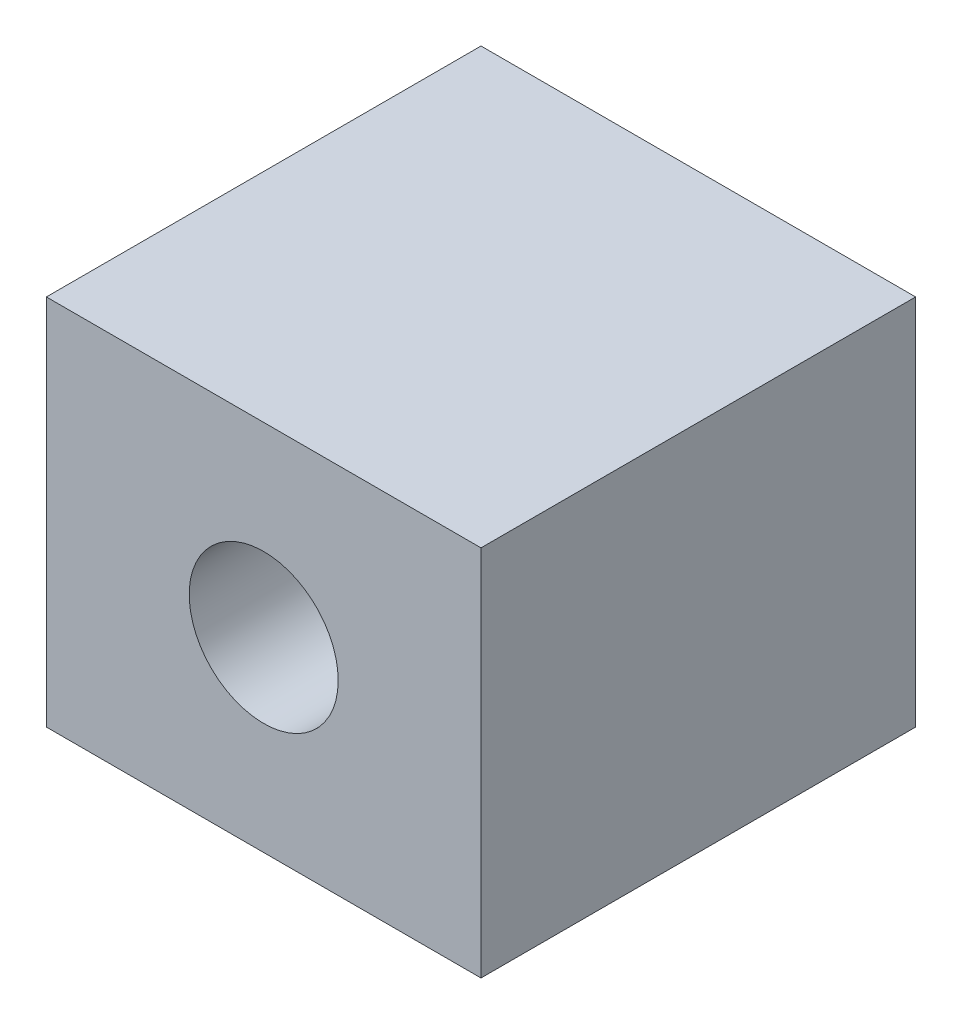
ISO-10303-21;
HEADER;
FILE_DESCRIPTION(('STEP AP214'),'2;1');
FILE_NAME('part.step','',(''),(''),'','','');
FILE_SCHEMA(('AUTOMOTIVE_DESIGN { 1 0 10303 214 1 1 1 1 }'));
ENDSEC;
DATA;
#1=APPLICATION_CONTEXT('core data for automotive mechanical design processes');
#2=APPLICATION_PROTOCOL_DEFINITION('international standard','automotive_design',2000,#1);
#3=PRODUCT_CONTEXT('',#1,'mechanical');
#4=PRODUCT('Part','Part','',(#3));
#5=PRODUCT_RELATED_PRODUCT_CATEGORY('part','',(#4));
#6=PRODUCT_DEFINITION_FORMATION('','',#4);
#7=PRODUCT_DEFINITION_CONTEXT('part definition',#1,'design');
#8=PRODUCT_DEFINITION('design','',#6,#7);
#9=PRODUCT_DEFINITION_SHAPE('','',#8);
#10=(LENGTH_UNIT() NAMED_UNIT(*) SI_UNIT(.MILLI.,.METRE.));
#11=(NAMED_UNIT(*) PLANE_ANGLE_UNIT() SI_UNIT($,.RADIAN.));
#12=(NAMED_UNIT(*) SI_UNIT($,.STERADIAN.) SOLID_ANGLE_UNIT());
#13=UNCERTAINTY_MEASURE_WITH_UNIT(LENGTH_MEASURE(1.E-05),#10,'distance_accuracy_value','');
#14=(GEOMETRIC_REPRESENTATION_CONTEXT(3) GLOBAL_UNCERTAINTY_ASSIGNED_CONTEXT((#13)) GLOBAL_UNIT_ASSIGNED_CONTEXT((#10,
#11,#12)) REPRESENTATION_CONTEXT('',''));
#15=CARTESIAN_POINT('',(0.,0.,0.));
#16=DIRECTION('',(0.,0.,1.));
#17=DIRECTION('',(1.,0.,0.));
#18=AXIS2_PLACEMENT_3D('',#15,#16,#17);
#19=CARTESIAN_POINT('',(0.,0.,35.));
#20=DIRECTION('',(0.,0.,-1.));
#21=DIRECTION('',(-1.,0.,0.));
#22=AXIS2_PLACEMENT_3D('',#19,#20,#21);
#23=PLANE('',#22);
#24=DIRECTION('',(0.,1.,0.));
#25=VECTOR('',#24,1.);
#26=CARTESIAN_POINT('',(17.5,-15.,35.));
#27=LINE('',#26,#25);
#28=CARTESIAN_POINT('',(17.5,-15.,35.));
#29=VERTEX_POINT('',#28);
#30=CARTESIAN_POINT('',(17.5,15.,35.));
#31=VERTEX_POINT('',#30);
#32=EDGE_CURVE('E89',#29,#31,#27,.T.);
#33=ORIENTED_EDGE('',*,*,#32,.T.);
#34=DIRECTION('',(-1.,0.,0.));
#35=VECTOR('',#34,1.);
#36=CARTESIAN_POINT('',(-17.5,15.,35.));
#37=LINE('',#36,#35);
#38=CARTESIAN_POINT('',(-17.5,15.,35.));
#39=VERTEX_POINT('',#38);
#40=EDGE_CURVE('E84',#31,#39,#37,.T.);
#41=ORIENTED_EDGE('',*,*,#40,.T.);
#42=DIRECTION('',(0.,-1.,0.));
#43=VECTOR('',#42,1.);
#44=CARTESIAN_POINT('',(-17.5,-15.,35.));
#45=LINE('',#44,#43);
#46=CARTESIAN_POINT('',(-17.5,-15.,35.));
#47=VERTEX_POINT('',#46);
#48=EDGE_CURVE('E87',#39,#47,#45,.T.);
#49=ORIENTED_EDGE('',*,*,#48,.T.);
#50=DIRECTION('',(1.,0.,0.));
#51=VECTOR('',#50,1.);
#52=CARTESIAN_POINT('',(-17.5,-15.,35.));
#53=LINE('',#52,#51);
#54=EDGE_CURVE('E54',#47,#29,#53,.T.);
#55=ORIENTED_EDGE('',*,*,#54,.T.);
#56=EDGE_LOOP('',(#33,#41,#49,#55));
#57=FACE_BOUND('',#56,.T.);
#58=CARTESIAN_POINT('',(0.,0.,35.));
#59=DIRECTION('',(0.,0.,1.));
#60=DIRECTION('',(1.,0.,0.));
#61=AXIS2_PLACEMENT_3D('',#58,#59,#60);
#62=CIRCLE('',#61,6.);
#63=CARTESIAN_POINT('',(6.00000000000001,0.,35.));
#64=VERTEX_POINT('',#63);
#65=EDGE_CURVE('E104',#64,#64,#62,.T.);
#66=ORIENTED_EDGE('',*,*,#65,.F.);
#67=EDGE_LOOP('',(#66));
#68=FACE_BOUND('',#67,.T.);
#69=ADVANCED_FACE('F37',(#57,#68),#23,.F.);
#70=CARTESIAN_POINT('',(0.,0.,0.));
#71=DIRECTION('',(0.,0.,-1.));
#72=DIRECTION('',(-1.,0.,0.));
#73=AXIS2_PLACEMENT_3D('',#70,#71,#72);
#74=PLANE('',#73);
#75=DIRECTION('',(0.,1.,0.));
#76=VECTOR('',#75,1.);
#77=CARTESIAN_POINT('',(17.5,-15.,0.));
#78=LINE('',#77,#76);
#79=CARTESIAN_POINT('',(17.5,-15.,0.));
#80=VERTEX_POINT('',#79);
#81=CARTESIAN_POINT('',(17.5,15.,0.));
#82=VERTEX_POINT('',#81);
#83=EDGE_CURVE('E101',#80,#82,#78,.T.);
#84=ORIENTED_EDGE('',*,*,#83,.F.);
#85=DIRECTION('',(1.,0.,0.));
#86=VECTOR('',#85,1.);
#87=CARTESIAN_POINT('',(-17.5,-15.,0.));
#88=LINE('',#87,#86);
#89=CARTESIAN_POINT('',(-17.5,-15.,0.));
#90=VERTEX_POINT('',#89);
#91=EDGE_CURVE('E77',#90,#80,#88,.T.);
#92=ORIENTED_EDGE('',*,*,#91,.F.);
#93=DIRECTION('',(0.,-1.,0.));
#94=VECTOR('',#93,1.);
#95=CARTESIAN_POINT('',(-17.5,-15.,0.));
#96=LINE('',#95,#94);
#97=CARTESIAN_POINT('',(-17.5,15.,0.));
#98=VERTEX_POINT('',#97);
#99=EDGE_CURVE('E71',#98,#90,#96,.T.);
#100=ORIENTED_EDGE('',*,*,#99,.F.);
#101=DIRECTION('',(-1.,0.,0.));
#102=VECTOR('',#101,1.);
#103=CARTESIAN_POINT('',(-17.5,15.,0.));
#104=LINE('',#103,#102);
#105=EDGE_CURVE('E93',#82,#98,#104,.T.);
#106=ORIENTED_EDGE('',*,*,#105,.F.);
#107=EDGE_LOOP('',(#84,#92,#100,#106));
#108=FACE_BOUND('',#107,.T.);
#109=CARTESIAN_POINT('',(0.,0.,0.));
#110=DIRECTION('',(0.,0.,1.));
#111=DIRECTION('',(1.,0.,0.));
#112=AXIS2_PLACEMENT_3D('',#109,#110,#111);
#113=CIRCLE('',#112,6.);
#114=CARTESIAN_POINT('',(6.00000000000001,0.,0.));
#115=VERTEX_POINT('',#114);
#116=EDGE_CURVE('E116',#115,#115,#113,.T.);
#117=ORIENTED_EDGE('',*,*,#116,.T.);
#118=EDGE_LOOP('',(#117));
#119=FACE_BOUND('',#118,.T.);
#120=ADVANCED_FACE('F112',(#108,#119),#74,.T.);
#121=CARTESIAN_POINT('',(17.5,-15.,35.));
#122=DIRECTION('',(-1.,0.,0.));
#123=DIRECTION('',(0.,0.,1.));
#124=AXIS2_PLACEMENT_3D('',#121,#122,#123);
#125=PLANE('',#124);
#126=ORIENTED_EDGE('',*,*,#83,.T.);
#127=DIRECTION('',(0.,0.,-1.));
#128=VECTOR('',#127,1.);
#129=CARTESIAN_POINT('',(17.5,15.,35.));
#130=LINE('',#129,#128);
#131=EDGE_CURVE('E11',#31,#82,#130,.T.);
#132=ORIENTED_EDGE('',*,*,#131,.F.);
#133=ORIENTED_EDGE('',*,*,#32,.F.);
#134=DIRECTION('',(0.,0.,-1.));
#135=VECTOR('',#134,1.);
#136=CARTESIAN_POINT('',(17.5,-15.,35.));
#137=LINE('',#136,#135);
#138=EDGE_CURVE('E97',#29,#80,#137,.T.);
#139=ORIENTED_EDGE('',*,*,#138,.T.);
#140=EDGE_LOOP('',(#126,#132,#133,#139));
#141=FACE_BOUND('',#140,.T.);
#142=ADVANCED_FACE('F39',(#141),#125,.F.);
#143=CARTESIAN_POINT('',(-17.5,15.,35.));
#144=DIRECTION('',(0.,-1.,0.));
#145=DIRECTION('',(0.,0.,-1.));
#146=AXIS2_PLACEMENT_3D('',#143,#144,#145);
#147=PLANE('',#146);
#148=ORIENTED_EDGE('',*,*,#105,.T.);
#149=DIRECTION('',(0.,0.,-1.));
#150=VECTOR('',#149,1.);
#151=CARTESIAN_POINT('',(-17.5,15.,35.));
#152=LINE('',#151,#150);
#153=EDGE_CURVE('E46',#39,#98,#152,.T.);
#154=ORIENTED_EDGE('',*,*,#153,.F.);
#155=ORIENTED_EDGE('',*,*,#40,.F.);
#156=ORIENTED_EDGE('',*,*,#131,.T.);
#157=EDGE_LOOP('',(#148,#154,#155,#156));
#158=FACE_BOUND('',#157,.T.);
#159=ADVANCED_FACE('F92',(#158),#147,.F.);
#160=CARTESIAN_POINT('',(-17.5,-15.,35.));
#161=DIRECTION('',(1.,0.,0.));
#162=DIRECTION('',(0.,0.,-1.));
#163=AXIS2_PLACEMENT_3D('',#160,#161,#162);
#164=PLANE('',#163);
#165=ORIENTED_EDGE('',*,*,#99,.T.);
#166=DIRECTION('',(0.,0.,-1.));
#167=VECTOR('',#166,1.);
#168=CARTESIAN_POINT('',(-17.5,-15.,35.));
#169=LINE('',#168,#167);
#170=EDGE_CURVE('E94',#47,#90,#169,.T.);
#171=ORIENTED_EDGE('',*,*,#170,.F.);
#172=ORIENTED_EDGE('',*,*,#48,.F.);
#173=ORIENTED_EDGE('',*,*,#153,.T.);
#174=EDGE_LOOP('',(#165,#171,#172,#173));
#175=FACE_BOUND('',#174,.T.);
#176=ADVANCED_FACE('F95',(#175),#164,.F.);
#177=CARTESIAN_POINT('',(-17.5,-15.,35.));
#178=DIRECTION('',(0.,1.,0.));
#179=DIRECTION('',(0.,0.,1.));
#180=AXIS2_PLACEMENT_3D('',#177,#178,#179);
#181=PLANE('',#180);
#182=ORIENTED_EDGE('',*,*,#91,.T.);
#183=ORIENTED_EDGE('',*,*,#138,.F.);
#184=ORIENTED_EDGE('',*,*,#54,.F.);
#185=ORIENTED_EDGE('',*,*,#170,.T.);
#186=EDGE_LOOP('',(#182,#183,#184,#185));
#187=FACE_BOUND('',#186,.T.);
#188=ADVANCED_FACE('F109',(#187),#181,.F.);
#189=CARTESIAN_POINT('',(0.,0.,35.));
#190=DIRECTION('',(0.,0.,-1.));
#191=DIRECTION('',(-1.,0.,0.));
#192=AXIS2_PLACEMENT_3D('',#189,#190,#191);
#193=CYLINDRICAL_SURFACE('',#192,6.);
#194=ORIENTED_EDGE('',*,*,#65,.T.);
#195=EDGE_LOOP('',(#194));
#196=FACE_BOUND('',#195,.T.);
#197=ORIENTED_EDGE('',*,*,#116,.F.);
#198=EDGE_LOOP('',(#197));
#199=FACE_BOUND('',#198,.T.);
#200=ADVANCED_FACE('F122',(#196,#199),#193,.F.);
#201=CLOSED_SHELL('',(#69,#120,#142,#159,#176,#188,#200));
#202=MANIFOLD_SOLID_BREP('B2',#201);
#203=ADVANCED_BREP_SHAPE_REPRESENTATION('',(#18,#202),#14);
#204=SHAPE_DEFINITION_REPRESENTATION(#9,#203);
ENDSEC;
END-ISO-10303-21;
